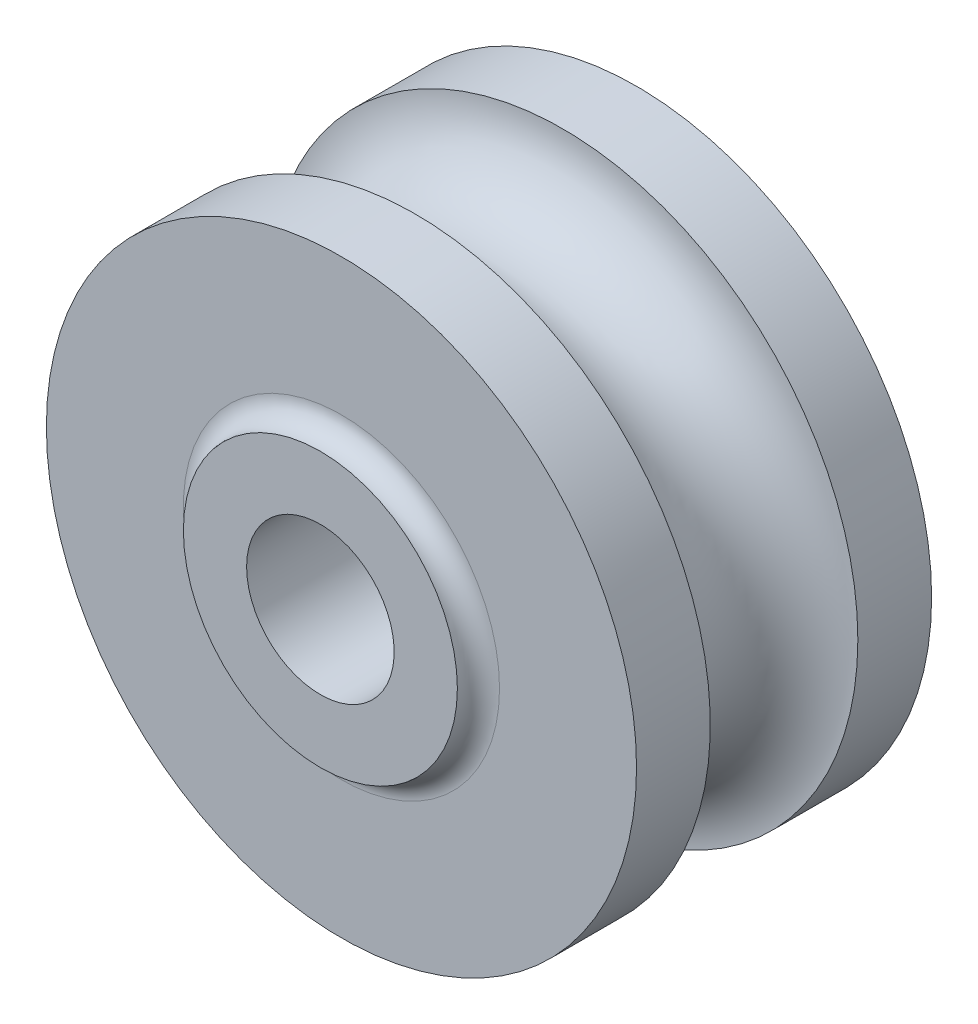
ISO-10303-21;
HEADER;
FILE_DESCRIPTION(('STEP AP214'),'2;1');
FILE_NAME('part.step','',(''),(''),'','','');
FILE_SCHEMA(('AUTOMOTIVE_DESIGN { 1 0 10303 214 1 1 1 1 }'));
ENDSEC;
DATA;
#1=APPLICATION_CONTEXT('core data for automotive mechanical design processes');
#2=APPLICATION_PROTOCOL_DEFINITION('international standard','automotive_design',2000,#1);
#3=PRODUCT_CONTEXT('',#1,'mechanical');
#4=PRODUCT('Part','Part','',(#3));
#5=PRODUCT_RELATED_PRODUCT_CATEGORY('part','',(#4));
#6=PRODUCT_DEFINITION_FORMATION('','',#4);
#7=PRODUCT_DEFINITION_CONTEXT('part definition',#1,'design');
#8=PRODUCT_DEFINITION('design','',#6,#7);
#9=PRODUCT_DEFINITION_SHAPE('','',#8);
#10=(LENGTH_UNIT() NAMED_UNIT(*) SI_UNIT(.MILLI.,.METRE.));
#11=(NAMED_UNIT(*) PLANE_ANGLE_UNIT() SI_UNIT($,.RADIAN.));
#12=(NAMED_UNIT(*) SI_UNIT($,.STERADIAN.) SOLID_ANGLE_UNIT());
#13=UNCERTAINTY_MEASURE_WITH_UNIT(LENGTH_MEASURE(1.E-05),#10,'distance_accuracy_value','');
#14=(GEOMETRIC_REPRESENTATION_CONTEXT(3) GLOBAL_UNCERTAINTY_ASSIGNED_CONTEXT((#13)) GLOBAL_UNIT_ASSIGNED_CONTEXT((#10,
#11,#12)) REPRESENTATION_CONTEXT('',''));
#15=CARTESIAN_POINT('',(0.,0.,0.));
#16=DIRECTION('',(0.,0.,1.));
#17=DIRECTION('',(1.,0.,0.));
#18=AXIS2_PLACEMENT_3D('',#15,#16,#17);
#19=CARTESIAN_POINT('',(0.,0.,28.));
#20=DIRECTION('',(0.,0.,-1.));
#21=DIRECTION('',(-1.,0.,0.));
#22=AXIS2_PLACEMENT_3D('',#19,#20,#21);
#23=CYLINDRICAL_SURFACE('',#22,28.);
#24=CARTESIAN_POINT('',(0.,0.,7.));
#25=DIRECTION('',(0.,0.,1.));
#26=DIRECTION('',(1.,0.,0.));
#27=AXIS2_PLACEMENT_3D('',#24,#25,#26);
#28=CIRCLE('',#27,28.);
#29=CARTESIAN_POINT('',(28.,0.,7.));
#30=VERTEX_POINT('',#29);
#31=EDGE_CURVE('E58',#30,#30,#28,.F.);
#32=ORIENTED_EDGE('',*,*,#31,.T.);
#33=EDGE_LOOP('',(#32));
#34=FACE_BOUND('',#33,.T.);
#35=CARTESIAN_POINT('',(0.,0.,0.));
#36=DIRECTION('',(0.,0.,1.));
#37=DIRECTION('',(1.,0.,0.));
#38=AXIS2_PLACEMENT_3D('',#35,#36,#37);
#39=CIRCLE('',#38,28.);
#40=CARTESIAN_POINT('',(28.,0.,0.));
#41=VERTEX_POINT('',#40);
#42=EDGE_CURVE('E55',#41,#41,#39,.T.);
#43=ORIENTED_EDGE('',*,*,#42,.T.);
#44=EDGE_LOOP('',(#43));
#45=FACE_BOUND('',#44,.T.);
#46=ADVANCED_FACE('F37',(#34,#45),#23,.T.);
#47=CARTESIAN_POINT('',(0.,0.,0.));
#48=DIRECTION('',(0.,0.,1.));
#49=DIRECTION('',(1.,0.,0.));
#50=AXIS2_PLACEMENT_3D('',#47,#48,#49);
#51=PLANE('',#50);
#52=CARTESIAN_POINT('',(0.,0.,0.));
#53=DIRECTION('',(0.,0.,1.));
#54=DIRECTION('',(1.,0.,0.));
#55=AXIS2_PLACEMENT_3D('',#52,#53,#54);
#56=CIRCLE('',#55,15.);
#57=CARTESIAN_POINT('',(15.,0.,0.));
#58=VERTEX_POINT('',#57);
#59=EDGE_CURVE('E45',#58,#58,#56,.T.);
#60=ORIENTED_EDGE('',*,*,#59,.T.);
#61=EDGE_LOOP('',(#60));
#62=FACE_BOUND('',#61,.T.);
#63=ORIENTED_EDGE('',*,*,#42,.F.);
#64=EDGE_LOOP('',(#63));
#65=FACE_BOUND('',#64,.T.);
#66=ADVANCED_FACE('F106',(#62,#65),#51,.F.);
#67=CARTESIAN_POINT('',(0.,0.,28.));
#68=DIRECTION('',(0.,0.,1.));
#69=DIRECTION('',(1.,0.,0.));
#70=AXIS2_PLACEMENT_3D('',#67,#68,#69);
#71=PLANE('',#70);
#72=CARTESIAN_POINT('',(0.,0.,28.));
#73=DIRECTION('',(0.,0.,1.));
#74=DIRECTION('',(1.,0.,0.));
#75=AXIS2_PLACEMENT_3D('',#72,#73,#74);
#76=CIRCLE('',#75,15.);
#77=CARTESIAN_POINT('',(15.,0.,28.));
#78=VERTEX_POINT('',#77);
#79=EDGE_CURVE('E10',#78,#78,#76,.F.);
#80=ORIENTED_EDGE('',*,*,#79,.T.);
#81=EDGE_LOOP('',(#80));
#82=FACE_BOUND('',#81,.T.);
#83=CARTESIAN_POINT('',(0.,0.,28.));
#84=DIRECTION('',(0.,0.,1.));
#85=DIRECTION('',(1.,0.,0.));
#86=AXIS2_PLACEMENT_3D('',#83,#84,#85);
#87=CIRCLE('',#86,28.);
#88=CARTESIAN_POINT('',(28.,0.,28.));
#89=VERTEX_POINT('',#88);
#90=EDGE_CURVE('E50',#89,#89,#87,.T.);
#91=ORIENTED_EDGE('',*,*,#90,.T.);
#92=EDGE_LOOP('',(#91));
#93=FACE_BOUND('',#92,.T.);
#94=ADVANCED_FACE('F101',(#82,#93),#71,.T.);
#95=CARTESIAN_POINT('',(0.,0.,21.));
#96=DIRECTION('',(0.,0.,-1.));
#97=DIRECTION('',(-1.,0.,0.));
#98=AXIS2_PLACEMENT_3D('',#95,#96,#97);
#99=CIRCLE('',#98,28.);
#100=CARTESIAN_POINT('',(-28.,0.,21.));
#101=VERTEX_POINT('',#100);
#102=EDGE_CURVE('E63',#101,#101,#99,.F.);
#103=ORIENTED_EDGE('',*,*,#102,.T.);
#104=EDGE_LOOP('',(#103));
#105=FACE_BOUND('',#104,.T.);
#106=ORIENTED_EDGE('',*,*,#90,.F.);
#107=EDGE_LOOP('',(#106));
#108=FACE_BOUND('',#107,.T.);
#109=ADVANCED_FACE('F92',(#105,#108),#23,.T.);
#110=CARTESIAN_POINT('',(0.,0.,28.));
#111=DIRECTION('',(0.,0.,-1.));
#112=DIRECTION('',(-1.,0.,0.));
#113=AXIS2_PLACEMENT_3D('',#110,#111,#112);
#114=CYLINDRICAL_SURFACE('',#113,7.);
#115=CARTESIAN_POINT('',(0.,0.,-2.));
#116=DIRECTION('',(0.,0.,-1.));
#117=DIRECTION('',(-1.,0.,0.));
#118=AXIS2_PLACEMENT_3D('',#115,#116,#117);
#119=CIRCLE('',#118,7.);
#120=CARTESIAN_POINT('',(-7.,0.,-2.));
#121=VERTEX_POINT('',#120);
#122=EDGE_CURVE('E74',#121,#121,#119,.T.);
#123=ORIENTED_EDGE('',*,*,#122,.T.);
#124=EDGE_LOOP('',(#123));
#125=FACE_BOUND('',#124,.T.);
#126=CARTESIAN_POINT('',(0.,0.,30.));
#127=DIRECTION('',(0.,0.,-1.));
#128=DIRECTION('',(-1.,0.,0.));
#129=AXIS2_PLACEMENT_3D('',#126,#127,#128);
#130=CIRCLE('',#129,7.);
#131=CARTESIAN_POINT('',(-7.,0.,30.));
#132=VERTEX_POINT('',#131);
#133=EDGE_CURVE('E62',#132,#132,#130,.T.);
#134=ORIENTED_EDGE('',*,*,#133,.F.);
#135=EDGE_LOOP('',(#134));
#136=FACE_BOUND('',#135,.T.);
#137=ADVANCED_FACE('F89',(#125,#136),#114,.F.);
#138=CARTESIAN_POINT('',(0.,0.,-2.));
#139=DIRECTION('',(0.,0.,-1.));
#140=DIRECTION('',(-1.,0.,0.));
#141=AXIS2_PLACEMENT_3D('',#138,#139,#140);
#142=PLANE('',#141);
#143=CARTESIAN_POINT('',(0.,0.,-2.));
#144=DIRECTION('',(0.,0.,-1.));
#145=DIRECTION('',(-1.,0.,0.));
#146=AXIS2_PLACEMENT_3D('',#143,#144,#145);
#147=CIRCLE('',#146,13.);
#148=CARTESIAN_POINT('',(-13.,0.,-2.));
#149=VERTEX_POINT('',#148);
#150=EDGE_CURVE('E69',#149,#149,#147,.T.);
#151=ORIENTED_EDGE('',*,*,#150,.T.);
#152=EDGE_LOOP('',(#151));
#153=FACE_BOUND('',#152,.T.);
#154=ORIENTED_EDGE('',*,*,#122,.F.);
#155=EDGE_LOOP('',(#154));
#156=FACE_BOUND('',#155,.T.);
#157=ADVANCED_FACE('F91',(#153,#156),#142,.T.);
#158=CARTESIAN_POINT('',(0.,0.,30.));
#159=DIRECTION('',(0.,0.,1.));
#160=DIRECTION('',(-1.,0.,0.));
#161=AXIS2_PLACEMENT_3D('',#158,#159,#160);
#162=PLANE('',#161);
#163=ORIENTED_EDGE('',*,*,#133,.T.);
#164=EDGE_LOOP('',(#163));
#165=FACE_BOUND('',#164,.T.);
#166=CARTESIAN_POINT('',(0.,0.,30.));
#167=DIRECTION('',(0.,0.,-1.));
#168=DIRECTION('',(-1.,0.,0.));
#169=AXIS2_PLACEMENT_3D('',#166,#167,#168);
#170=CIRCLE('',#169,13.);
#171=CARTESIAN_POINT('',(-13.,0.,30.));
#172=VERTEX_POINT('',#171);
#173=EDGE_CURVE('E78',#172,#172,#170,.T.);
#174=ORIENTED_EDGE('',*,*,#173,.F.);
#175=EDGE_LOOP('',(#174));
#176=FACE_BOUND('',#175,.T.);
#177=ADVANCED_FACE('F86',(#165,#176),#162,.T.);
#178=CARTESIAN_POINT('',(0.,0.,14.));
#179=DIRECTION('',(0.,0.,-1.));
#180=DIRECTION('',(-1.,0.,0.));
#181=AXIS2_PLACEMENT_3D('',#178,#179,#180);
#182=TOROIDAL_SURFACE('',#181,28.,7.);
#183=ORIENTED_EDGE('',*,*,#102,.F.);
#184=EDGE_LOOP('',(#183));
#185=FACE_BOUND('',#184,.T.);
#186=ORIENTED_EDGE('',*,*,#31,.F.);
#187=EDGE_LOOP('',(#186));
#188=FACE_BOUND('',#187,.T.);
#189=ADVANCED_FACE('F115',(#185,#188),#182,.F.);
#190=CARTESIAN_POINT('',(0.,0.,-2.));
#191=DIRECTION('',(0.,0.,1.));
#192=DIRECTION('',(1.,0.,0.));
#193=AXIS2_PLACEMENT_3D('',#190,#191,#192);
#194=TOROIDAL_SURFACE('',#193,15.,2.);
#195=ORIENTED_EDGE('',*,*,#59,.F.);
#196=EDGE_LOOP('',(#195));
#197=FACE_BOUND('',#196,.T.);
#198=ORIENTED_EDGE('',*,*,#150,.F.);
#199=EDGE_LOOP('',(#198));
#200=FACE_BOUND('',#199,.T.);
#201=ADVANCED_FACE('F113',(#197,#200),#194,.F.);
#202=CARTESIAN_POINT('',(0.,0.,30.));
#203=DIRECTION('',(0.,0.,1.));
#204=DIRECTION('',(1.,0.,0.));
#205=AXIS2_PLACEMENT_3D('',#202,#203,#204);
#206=TOROIDAL_SURFACE('',#205,15.,2.);
#207=ORIENTED_EDGE('',*,*,#79,.F.);
#208=EDGE_LOOP('',(#207));
#209=FACE_BOUND('',#208,.T.);
#210=ORIENTED_EDGE('',*,*,#173,.T.);
#211=EDGE_LOOP('',(#210));
#212=FACE_BOUND('',#211,.T.);
#213=ADVANCED_FACE('F39',(#209,#212),#206,.F.);
#214=CLOSED_SHELL('',(#46,#66,#94,#109,#137,#157,#177,#189,#201,#213));
#215=MANIFOLD_SOLID_BREP('B2',#214);
#216=ADVANCED_BREP_SHAPE_REPRESENTATION('',(#18,#215),#14);
#217=SHAPE_DEFINITION_REPRESENTATION(#9,#216);
ENDSEC;
END-ISO-10303-21;
